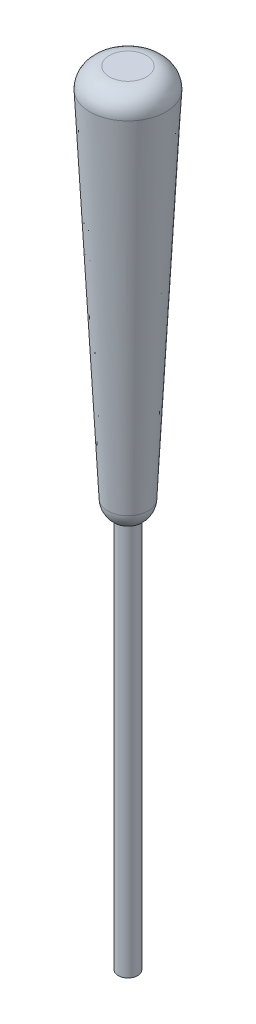
ISO-10303-21;
HEADER;
FILE_DESCRIPTION(('STEP AP214'),'2;1');
FILE_NAME('part.step','',(''),(''),'','','');
FILE_SCHEMA(('AUTOMOTIVE_DESIGN { 1 0 10303 214 1 1 1 1 }'));
ENDSEC;
DATA;
#1=APPLICATION_CONTEXT('core data for automotive mechanical design processes');
#2=APPLICATION_PROTOCOL_DEFINITION('international standard','automotive_design',2000,#1);
#3=PRODUCT_CONTEXT('',#1,'mechanical');
#4=PRODUCT('Part','Part','',(#3));
#5=PRODUCT_RELATED_PRODUCT_CATEGORY('part','',(#4));
#6=PRODUCT_DEFINITION_FORMATION('','',#4);
#7=PRODUCT_DEFINITION_CONTEXT('part definition',#1,'design');
#8=PRODUCT_DEFINITION('design','',#6,#7);
#9=PRODUCT_DEFINITION_SHAPE('','',#8);
#10=(LENGTH_UNIT() NAMED_UNIT(*) SI_UNIT(.MILLI.,.METRE.));
#11=(NAMED_UNIT(*) PLANE_ANGLE_UNIT() SI_UNIT($,.RADIAN.));
#12=(NAMED_UNIT(*) SI_UNIT($,.STERADIAN.) SOLID_ANGLE_UNIT());
#13=UNCERTAINTY_MEASURE_WITH_UNIT(LENGTH_MEASURE(1.E-05),#10,'distance_accuracy_value','');
#14=(GEOMETRIC_REPRESENTATION_CONTEXT(3) GLOBAL_UNCERTAINTY_ASSIGNED_CONTEXT((#13)) GLOBAL_UNIT_ASSIGNED_CONTEXT((#10,
#11,#12)) REPRESENTATION_CONTEXT('',''));
#15=CARTESIAN_POINT('',(0.,0.,0.));
#16=DIRECTION('',(0.,0.,1.));
#17=DIRECTION('',(1.,0.,0.));
#18=AXIS2_PLACEMENT_3D('',#15,#16,#17);
#19=CARTESIAN_POINT('',(0.,0.,0.));
#20=DIRECTION('',(0.,1.,0.));
#21=DIRECTION('',(0.,0.,1.));
#22=AXIS2_PLACEMENT_3D('',#19,#20,#21);
#23=PLANE('',#22);
#24=CARTESIAN_POINT('',(0.,0.,0.));
#25=DIRECTION('',(0.,-1.,0.));
#26=DIRECTION('',(0.,0.,-1.));
#27=AXIS2_PLACEMENT_3D('',#24,#25,#26);
#28=CIRCLE('',#27,2.5);
#29=CARTESIAN_POINT('',(0.,0.,-2.5));
#30=VERTEX_POINT('',#29);
#31=EDGE_CURVE('E43',#30,#30,#28,.F.);
#32=ORIENTED_EDGE('',*,*,#31,.F.);
#33=EDGE_LOOP('',(#32));
#34=FACE_BOUND('',#33,.T.);
#35=ADVANCED_FACE('F17',(#34),#23,.F.);
#36=CARTESIAN_POINT('',(0.,100.,0.));
#37=DIRECTION('',(0.,-1.,0.));
#38=DIRECTION('',(0.,0.,-1.));
#39=AXIS2_PLACEMENT_3D('',#36,#37,#38);
#40=CYLINDRICAL_SURFACE('',#39,2.5);
#41=ORIENTED_EDGE('',*,*,#31,.T.);
#42=EDGE_LOOP('',(#41));
#43=FACE_BOUND('',#42,.T.);
#44=CARTESIAN_POINT('',(0.,100.,0.));
#45=DIRECTION('',(0.,-1.,0.));
#46=DIRECTION('',(0.,0.,-1.));
#47=AXIS2_PLACEMENT_3D('',#44,#45,#46);
#48=CIRCLE('',#47,2.5);
#49=CARTESIAN_POINT('',(0.,100.,-2.5));
#50=VERTEX_POINT('',#49);
#51=EDGE_CURVE('E42',#50,#50,#48,.F.);
#52=ORIENTED_EDGE('',*,*,#51,.F.);
#53=EDGE_LOOP('',(#52));
#54=FACE_BOUND('',#53,.T.);
#55=ADVANCED_FACE('F64',(#43,#54),#40,.T.);
#56=CARTESIAN_POINT('',(0.,200.,0.));
#57=DIRECTION('',(0.,1.,0.));
#58=DIRECTION('',(0.,0.,1.));
#59=AXIS2_PLACEMENT_3D('',#56,#57,#58);
#60=PLANE('',#59);
#61=CARTESIAN_POINT('',(0.,200.,0.));
#62=DIRECTION('',(0.,-1.,0.));
#63=DIRECTION('',(0.,0.,-1.));
#64=AXIS2_PLACEMENT_3D('',#61,#62,#63);
#65=CIRCLE('',#64,4.7437539013748);
#66=CARTESIAN_POINT('',(0.,200.,-4.7437539013748));
#67=VERTEX_POINT('',#66);
#68=CARTESIAN_POINT('',(0.,200.,4.7437539013748));
#69=VERTEX_POINT('',#68);
#70=EDGE_CURVE('E40',#67,#69,#65,.T.);
#71=ORIENTED_EDGE('',*,*,#70,.F.);
#72=CARTESIAN_POINT('',(0.,200.,0.));
#73=DIRECTION('',(0.,-1.,0.));
#74=DIRECTION('',(0.,0.,1.));
#75=AXIS2_PLACEMENT_3D('',#72,#73,#74);
#76=CIRCLE('',#75,4.7437539013748);
#77=EDGE_CURVE('E34',#69,#67,#76,.T.);
#78=ORIENTED_EDGE('',*,*,#77,.F.);
#79=EDGE_LOOP('',(#71,#78));
#80=FACE_BOUND('',#79,.T.);
#81=ADVANCED_FACE('F46',(#80),#60,.T.);
#82=CARTESIAN_POINT('',(0.,104.447924199686,-0.216150111359118));
#83=DIRECTION('',(1.,0.,0.));
#84=DIRECTION('',(0.,0.,-1.));
#85=AXIS2_PLACEMENT_3D('',#82,#83,#84);
#86=CIRCLE('',#85,5.);
#87=TRIMMED_CURVE('',#86,(PARAMETER_VALUE(-1.61403982536489)),
(PARAMETER_VALUE(1.61403982536489)),.T.,.PARAMETER.);
#88=CARTESIAN_POINT('',(0.,104.447924199686,0.));
#89=DIRECTION('',(0.,-1.,0.));
#90=AXIS1_PLACEMENT('',#88,#89);
#91=SURFACE_OF_REVOLUTION('',#87,#90);
#92=ORIENTED_EDGE('',*,*,#51,.T.);
#93=EDGE_LOOP('',(#92));
#94=FACE_BOUND('',#93,.T.);
#95=CARTESIAN_POINT('',(0.,104.198236114939,0.));
#96=DIRECTION('',(0.,1.,0.));
#97=DIRECTION('',(0.,0.,1.));
#98=AXIS2_PLACEMENT_3D('',#95,#96,#97);
#99=CIRCLE('',#98,5.20991180574626);
#100=CARTESIAN_POINT('',(0.,104.198236114939,5.20991180574626));
#101=VERTEX_POINT('',#100);
#102=EDGE_CURVE('E27',#101,#101,#99,.T.);
#103=ORIENTED_EDGE('',*,*,#102,.F.);
#104=EDGE_LOOP('',(#103));
#105=FACE_BOUND('',#104,.T.);
#106=ADVANCED_FACE('F63',(#94,#105),#91,.F.);
#107=CARTESIAN_POINT('',(0.,195.,4.7437539013748));
#108=DIRECTION('',(1.,0.,0.));
#109=DIRECTION('',(0.,0.,1.));
#110=AXIS2_PLACEMENT_3D('',#107,#108,#109);
#111=CIRCLE('',#110,5.);
#112=TRIMMED_CURVE('',#111,(PARAMETER_VALUE(-2.82005556507712)),
(PARAMETER_VALUE(2.82005556507712)),.T.,.PARAMETER.);
#113=CARTESIAN_POINT('',(0.,195.,0.));
#114=DIRECTION('',(0.,1.,0.));
#115=AXIS1_PLACEMENT('',#113,#114);
#116=SURFACE_OF_REVOLUTION('',#112,#115);
#117=ORIENTED_EDGE('',*,*,#77,.T.);
#118=ORIENTED_EDGE('',*,*,#70,.T.);
#119=EDGE_LOOP('',(#117,#118));
#120=FACE_BOUND('',#119,.T.);
#121=CARTESIAN_POINT('',(0.,194.7503119153,0.));
#122=DIRECTION('',(0.,1.,0.));
#123=DIRECTION('',(0.,0.,1.));
#124=AXIS2_PLACEMENT_3D('',#121,#122,#123);
#125=CIRCLE('',#124,9.73751559576286);
#126=CARTESIAN_POINT('',(0.,194.7503119153,9.73751559576286));
#127=VERTEX_POINT('',#126);
#128=EDGE_CURVE('E11',#127,#127,#125,.F.);
#129=ORIENTED_EDGE('',*,*,#128,.F.);
#130=EDGE_LOOP('',(#129));
#131=FACE_BOUND('',#130,.T.);
#132=ADVANCED_FACE('F38',(#120,#131),#116,.F.);
#133=CARTESIAN_POINT('',(0.,194.750311915243,0.));
#134=DIRECTION('',(0.,1.,0.));
#135=DIRECTION('',(-1.,0.,0.));
#136=AXIS2_PLACEMENT_3D('',#133,#134,#135);
#137=CONICAL_SURFACE('',#136,9.73751559575931,0.0499583957219349);
#138=ORIENTED_EDGE('',*,*,#128,.T.);
#139=EDGE_LOOP('',(#138));
#140=FACE_BOUND('',#139,.T.);
#141=ORIENTED_EDGE('',*,*,#102,.T.);
#142=EDGE_LOOP('',(#141));
#143=FACE_BOUND('',#142,.T.);
#144=ADVANCED_FACE('F85',(#140,#143),#137,.T.);
#145=CLOSED_SHELL('',(#35,#55,#81,#106,#132,#144));
#146=MANIFOLD_SOLID_BREP('B1',#145);
#147=ADVANCED_BREP_SHAPE_REPRESENTATION('',(#18,#146),#14);
#148=SHAPE_DEFINITION_REPRESENTATION(#9,#147);
ENDSEC;
END-ISO-10303-21;
